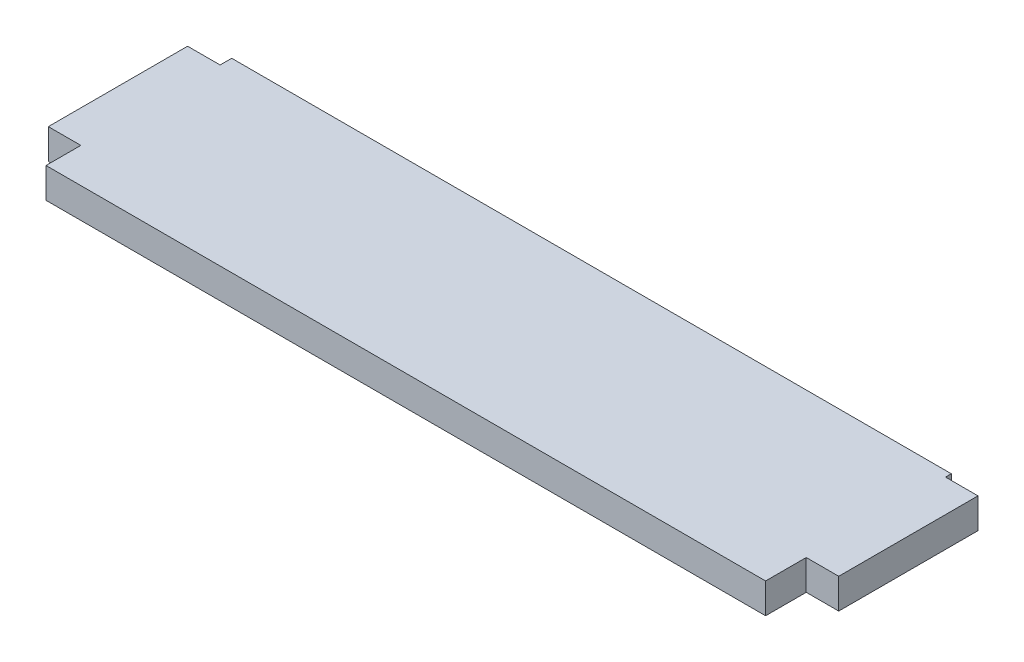
ISO-10303-21;
HEADER;
FILE_DESCRIPTION(('STEP AP214'),'2;1');
FILE_NAME('part.step','',(''),(''),'','','');
FILE_SCHEMA(('AUTOMOTIVE_DESIGN { 1 0 10303 214 1 1 1 1 }'));
ENDSEC;
DATA;
#1=APPLICATION_CONTEXT('core data for automotive mechanical design processes');
#2=APPLICATION_PROTOCOL_DEFINITION('international standard','automotive_design',2000,#1);
#3=PRODUCT_CONTEXT('',#1,'mechanical');
#4=PRODUCT('Part','Part','',(#3));
#5=PRODUCT_RELATED_PRODUCT_CATEGORY('part','',(#4));
#6=PRODUCT_DEFINITION_FORMATION('','',#4);
#7=PRODUCT_DEFINITION_CONTEXT('part definition',#1,'design');
#8=PRODUCT_DEFINITION('design','',#6,#7);
#9=PRODUCT_DEFINITION_SHAPE('','',#8);
#10=(LENGTH_UNIT() NAMED_UNIT(*) SI_UNIT(.MILLI.,.METRE.));
#11=(NAMED_UNIT(*) PLANE_ANGLE_UNIT() SI_UNIT($,.RADIAN.));
#12=(NAMED_UNIT(*) SI_UNIT($,.STERADIAN.) SOLID_ANGLE_UNIT());
#13=UNCERTAINTY_MEASURE_WITH_UNIT(LENGTH_MEASURE(1.E-05),#10,'distance_accuracy_value','');
#14=(GEOMETRIC_REPRESENTATION_CONTEXT(3) GLOBAL_UNCERTAINTY_ASSIGNED_CONTEXT((#13)) GLOBAL_UNIT_ASSIGNED_CONTEXT((#10,
#11,#12)) REPRESENTATION_CONTEXT('',''));
#15=CARTESIAN_POINT('',(0.,0.,0.));
#16=DIRECTION('',(0.,0.,1.));
#17=DIRECTION('',(1.,0.,0.));
#18=AXIS2_PLACEMENT_3D('',#15,#16,#17);
#19=CARTESIAN_POINT('',(15.5,1.3,-4.));
#20=DIRECTION('',(-1.,0.,0.));
#21=DIRECTION('',(0.,0.,1.));
#22=AXIS2_PLACEMENT_3D('',#19,#20,#21);
#23=PLANE('',#22);
#24=DIRECTION('',(0.,-1.,0.));
#25=VECTOR('',#24,1.);
#26=CARTESIAN_POINT('',(15.5,1.3,2.25));
#27=LINE('',#26,#25);
#28=CARTESIAN_POINT('',(15.5,1.3,2.25));
#29=VERTEX_POINT('',#28);
#30=CARTESIAN_POINT('',(15.5,0.,2.25));
#31=VERTEX_POINT('',#30);
#32=EDGE_CURVE('E281',#29,#31,#27,.T.);
#33=ORIENTED_EDGE('',*,*,#32,.F.);
#34=DIRECTION('',(0.,0.,-1.));
#35=VECTOR('',#34,1.);
#36=CARTESIAN_POINT('',(15.5,1.3,-4.));
#37=LINE('',#36,#35);
#38=CARTESIAN_POINT('',(15.5,1.3,4.));
#39=VERTEX_POINT('',#38);
#40=EDGE_CURVE('E204',#39,#29,#37,.T.);
#41=ORIENTED_EDGE('',*,*,#40,.F.);
#42=DIRECTION('',(0.,-1.,0.));
#43=VECTOR('',#42,1.);
#44=CARTESIAN_POINT('',(15.5,1.3,4.));
#45=LINE('',#44,#43);
#46=CARTESIAN_POINT('',(15.5,0.,4.));
#47=VERTEX_POINT('',#46);
#48=EDGE_CURVE('E220',#39,#47,#45,.T.);
#49=ORIENTED_EDGE('',*,*,#48,.T.);
#50=DIRECTION('',(0.,0.,-1.));
#51=VECTOR('',#50,1.);
#52=CARTESIAN_POINT('',(15.5,0.,-4.));
#53=LINE('',#52,#51);
#54=EDGE_CURVE('E221',#47,#31,#53,.T.);
#55=ORIENTED_EDGE('',*,*,#54,.T.);
#56=EDGE_LOOP('',(#33,#41,#49,#55));
#57=FACE_BOUND('',#56,.T.);
#58=ADVANCED_FACE('F43',(#57),#23,.F.);
#59=CARTESIAN_POINT('',(-15.5,1.3,-4.));
#60=DIRECTION('',(1.,0.,0.));
#61=DIRECTION('',(0.,0.,-1.));
#62=AXIS2_PLACEMENT_3D('',#59,#60,#61);
#63=PLANE('',#62);
#64=DIRECTION('',(0.,-1.,0.));
#65=VECTOR('',#64,1.);
#66=CARTESIAN_POINT('',(-15.5,1.3,-3.5));
#67=LINE('',#66,#65);
#68=CARTESIAN_POINT('',(-15.5,1.3,-3.5));
#69=VERTEX_POINT('',#68);
#70=CARTESIAN_POINT('',(-15.5,0.,-3.5));
#71=VERTEX_POINT('',#70);
#72=EDGE_CURVE('E200',#69,#71,#67,.T.);
#73=ORIENTED_EDGE('',*,*,#72,.F.);
#74=DIRECTION('',(0.,0.,1.));
#75=VECTOR('',#74,1.);
#76=CARTESIAN_POINT('',(-15.5,1.3,-4.));
#77=LINE('',#76,#75);
#78=CARTESIAN_POINT('',(-15.5,1.3,-4.));
#79=VERTEX_POINT('',#78);
#80=EDGE_CURVE('E213',#79,#69,#77,.T.);
#81=ORIENTED_EDGE('',*,*,#80,.F.);
#82=DIRECTION('',(0.,-1.,0.));
#83=VECTOR('',#82,1.);
#84=CARTESIAN_POINT('',(-15.5,1.3,-4.));
#85=LINE('',#84,#83);
#86=CARTESIAN_POINT('',(-15.5,0.,-4.));
#87=VERTEX_POINT('',#86);
#88=EDGE_CURVE('E52',#79,#87,#85,.T.);
#89=ORIENTED_EDGE('',*,*,#88,.T.);
#90=DIRECTION('',(0.,0.,1.));
#91=VECTOR('',#90,1.);
#92=CARTESIAN_POINT('',(-15.5,0.,-4.));
#93=LINE('',#92,#91);
#94=EDGE_CURVE('E229',#87,#71,#93,.T.);
#95=ORIENTED_EDGE('',*,*,#94,.T.);
#96=EDGE_LOOP('',(#73,#81,#89,#95));
#97=FACE_BOUND('',#96,.T.);
#98=ADVANCED_FACE('F249',(#97),#63,.F.);
#99=CARTESIAN_POINT('',(15.5,1.3,-3.75));
#100=VERTEX_POINT('',#99);
#101=CARTESIAN_POINT('',(15.5,1.3,-4.));
#102=VERTEX_POINT('',#101);
#103=EDGE_CURVE('E209',#100,#102,#37,.T.);
#104=ORIENTED_EDGE('',*,*,#103,.F.);
#105=DIRECTION('',(0.,-1.,0.));
#106=VECTOR('',#105,1.);
#107=CARTESIAN_POINT('',(15.5,1.3,-3.75));
#108=LINE('',#107,#106);
#109=CARTESIAN_POINT('',(15.5,0.,-3.75));
#110=VERTEX_POINT('',#109);
#111=EDGE_CURVE('E152',#100,#110,#108,.T.);
#112=ORIENTED_EDGE('',*,*,#111,.T.);
#113=CARTESIAN_POINT('',(15.5,0.,-4.));
#114=VERTEX_POINT('',#113);
#115=EDGE_CURVE('E158',#110,#114,#53,.T.);
#116=ORIENTED_EDGE('',*,*,#115,.T.);
#117=DIRECTION('',(0.,-1.,0.));
#118=VECTOR('',#117,1.);
#119=CARTESIAN_POINT('',(15.5,1.3,-4.));
#120=LINE('',#119,#118);
#121=EDGE_CURVE('E11',#102,#114,#120,.T.);
#122=ORIENTED_EDGE('',*,*,#121,.F.);
#123=EDGE_LOOP('',(#104,#112,#116,#122));
#124=FACE_BOUND('',#123,.T.);
#125=ADVANCED_FACE('F45',(#124),#23,.F.);
#126=CARTESIAN_POINT('',(-15.5,1.3,-4.));
#127=DIRECTION('',(0.,0.,1.));
#128=DIRECTION('',(1.,0.,0.));
#129=AXIS2_PLACEMENT_3D('',#126,#127,#128);
#130=PLANE('',#129);
#131=DIRECTION('',(-1.,0.,0.));
#132=VECTOR('',#131,1.);
#133=CARTESIAN_POINT('',(-15.5,0.,-4.));
#134=LINE('',#133,#132);
#135=EDGE_CURVE('E225',#114,#87,#134,.T.);
#136=ORIENTED_EDGE('',*,*,#135,.T.);
#137=ORIENTED_EDGE('',*,*,#88,.F.);
#138=DIRECTION('',(-1.,0.,0.));
#139=VECTOR('',#138,1.);
#140=CARTESIAN_POINT('',(-15.5,1.3,-4.));
#141=LINE('',#140,#139);
#142=EDGE_CURVE('E208',#102,#79,#141,.T.);
#143=ORIENTED_EDGE('',*,*,#142,.F.);
#144=ORIENTED_EDGE('',*,*,#121,.T.);
#145=EDGE_LOOP('',(#136,#137,#143,#144));
#146=FACE_BOUND('',#145,.T.);
#147=ADVANCED_FACE('F260',(#146),#130,.F.);
#148=CARTESIAN_POINT('',(-15.5,1.3,2.5));
#149=VERTEX_POINT('',#148);
#150=CARTESIAN_POINT('',(-15.5,1.3,4.));
#151=VERTEX_POINT('',#150);
#152=EDGE_CURVE('E212',#149,#151,#77,.T.);
#153=ORIENTED_EDGE('',*,*,#152,.F.);
#154=DIRECTION('',(0.,-1.,0.));
#155=VECTOR('',#154,1.);
#156=CARTESIAN_POINT('',(-15.5,1.3,2.5));
#157=LINE('',#156,#155);
#158=CARTESIAN_POINT('',(-15.5,0.,2.5));
#159=VERTEX_POINT('',#158);
#160=EDGE_CURVE('E183',#149,#159,#157,.T.);
#161=ORIENTED_EDGE('',*,*,#160,.T.);
#162=CARTESIAN_POINT('',(-15.5,0.,4.));
#163=VERTEX_POINT('',#162);
#164=EDGE_CURVE('E228',#159,#163,#93,.T.);
#165=ORIENTED_EDGE('',*,*,#164,.T.);
#166=DIRECTION('',(0.,-1.,0.));
#167=VECTOR('',#166,1.);
#168=CARTESIAN_POINT('',(-15.5,1.3,4.));
#169=LINE('',#168,#167);
#170=EDGE_CURVE('E239',#151,#163,#169,.T.);
#171=ORIENTED_EDGE('',*,*,#170,.F.);
#172=EDGE_LOOP('',(#153,#161,#165,#171));
#173=FACE_BOUND('',#172,.T.);
#174=ADVANCED_FACE('F272',(#173),#63,.F.);
#175=CARTESIAN_POINT('',(-15.5,1.3,4.));
#176=DIRECTION('',(0.,0.,-1.));
#177=DIRECTION('',(-1.,0.,0.));
#178=AXIS2_PLACEMENT_3D('',#175,#176,#177);
#179=PLANE('',#178);
#180=DIRECTION('',(1.,0.,0.));
#181=VECTOR('',#180,1.);
#182=CARTESIAN_POINT('',(-15.5,0.,4.));
#183=LINE('',#182,#181);
#184=EDGE_CURVE('E233',#163,#47,#183,.T.);
#185=ORIENTED_EDGE('',*,*,#184,.T.);
#186=ORIENTED_EDGE('',*,*,#48,.F.);
#187=DIRECTION('',(1.,0.,0.));
#188=VECTOR('',#187,1.);
#189=CARTESIAN_POINT('',(-15.5,1.3,4.));
#190=LINE('',#189,#188);
#191=EDGE_CURVE('E217',#151,#39,#190,.T.);
#192=ORIENTED_EDGE('',*,*,#191,.F.);
#193=ORIENTED_EDGE('',*,*,#170,.T.);
#194=EDGE_LOOP('',(#185,#186,#192,#193));
#195=FACE_BOUND('',#194,.T.);
#196=ADVANCED_FACE('F276',(#195),#179,.F.);
#197=CARTESIAN_POINT('',(0.,1.3,0.));
#198=DIRECTION('',(0.,1.,0.));
#199=DIRECTION('',(0.,0.,1.));
#200=AXIS2_PLACEMENT_3D('',#197,#198,#199);
#201=PLANE('',#200);
#202=ORIENTED_EDGE('',*,*,#40,.T.);
#203=DIRECTION('',(1.,0.,0.));
#204=VECTOR('',#203,1.);
#205=CARTESIAN_POINT('',(15.5,1.3,2.25));
#206=LINE('',#205,#204);
#207=CARTESIAN_POINT('',(16.9,1.3,2.25));
#208=VERTEX_POINT('',#207);
#209=EDGE_CURVE('E160',#29,#208,#206,.T.);
#210=ORIENTED_EDGE('',*,*,#209,.T.);
#211=DIRECTION('',(0.,0.,-1.));
#212=VECTOR('',#211,1.);
#213=CARTESIAN_POINT('',(16.9,1.3,-3.75));
#214=LINE('',#213,#212);
#215=CARTESIAN_POINT('',(16.9,1.3,-3.75));
#216=VERTEX_POINT('',#215);
#217=EDGE_CURVE('E163',#208,#216,#214,.T.);
#218=ORIENTED_EDGE('',*,*,#217,.T.);
#219=DIRECTION('',(-1.,0.,0.));
#220=VECTOR('',#219,1.);
#221=CARTESIAN_POINT('',(15.5,1.3,-3.75));
#222=LINE('',#221,#220);
#223=EDGE_CURVE('E150',#216,#100,#222,.T.);
#224=ORIENTED_EDGE('',*,*,#223,.T.);
#225=ORIENTED_EDGE('',*,*,#103,.T.);
#226=ORIENTED_EDGE('',*,*,#142,.T.);
#227=ORIENTED_EDGE('',*,*,#80,.T.);
#228=DIRECTION('',(-1.,0.,0.));
#229=VECTOR('',#228,1.);
#230=CARTESIAN_POINT('',(-15.5,1.3,-3.5));
#231=LINE('',#230,#229);
#232=CARTESIAN_POINT('',(-16.9,1.3,-3.5));
#233=VERTEX_POINT('',#232);
#234=EDGE_CURVE('E174',#69,#233,#231,.T.);
#235=ORIENTED_EDGE('',*,*,#234,.T.);
#236=DIRECTION('',(0.,0.,1.));
#237=VECTOR('',#236,1.);
#238=CARTESIAN_POINT('',(-16.9,1.3,-3.5));
#239=LINE('',#238,#237);
#240=CARTESIAN_POINT('',(-16.9,1.3,2.5));
#241=VERTEX_POINT('',#240);
#242=EDGE_CURVE('E177',#233,#241,#239,.T.);
#243=ORIENTED_EDGE('',*,*,#242,.T.);
#244=DIRECTION('',(1.,0.,0.));
#245=VECTOR('',#244,1.);
#246=CARTESIAN_POINT('',(-15.5,1.3,2.5));
#247=LINE('',#246,#245);
#248=EDGE_CURVE('E180',#241,#149,#247,.T.);
#249=ORIENTED_EDGE('',*,*,#248,.T.);
#250=ORIENTED_EDGE('',*,*,#152,.T.);
#251=ORIENTED_EDGE('',*,*,#191,.T.);
#252=EDGE_LOOP('',(#202,#210,#218,#224,#225,#226,#227,#235,#243,#249,#250,#251));
#253=FACE_BOUND('',#252,.T.);
#254=ADVANCED_FACE('F257',(#253),#201,.T.);
#255=CARTESIAN_POINT('',(0.,0.,0.));
#256=DIRECTION('',(0.,1.,0.));
#257=DIRECTION('',(0.,0.,1.));
#258=AXIS2_PLACEMENT_3D('',#255,#256,#257);
#259=PLANE('',#258);
#260=ORIENTED_EDGE('',*,*,#54,.F.);
#261=ORIENTED_EDGE('',*,*,#184,.F.);
#262=ORIENTED_EDGE('',*,*,#164,.F.);
#263=DIRECTION('',(1.,0.,0.));
#264=VECTOR('',#263,1.);
#265=CARTESIAN_POINT('',(-15.5,0.,2.5));
#266=LINE('',#265,#264);
#267=CARTESIAN_POINT('',(-16.9,0.,2.5));
#268=VERTEX_POINT('',#267);
#269=EDGE_CURVE('E67',#268,#159,#266,.T.);
#270=ORIENTED_EDGE('',*,*,#269,.F.);
#271=DIRECTION('',(0.,0.,1.));
#272=VECTOR('',#271,1.);
#273=CARTESIAN_POINT('',(-16.9,0.,-3.5));
#274=LINE('',#273,#272);
#275=CARTESIAN_POINT('',(-16.9,0.,-3.5));
#276=VERTEX_POINT('',#275);
#277=EDGE_CURVE('E186',#276,#268,#274,.T.);
#278=ORIENTED_EDGE('',*,*,#277,.F.);
#279=DIRECTION('',(-1.,0.,0.));
#280=VECTOR('',#279,1.);
#281=CARTESIAN_POINT('',(-15.5,0.,-3.5));
#282=LINE('',#281,#280);
#283=EDGE_CURVE('E169',#71,#276,#282,.T.);
#284=ORIENTED_EDGE('',*,*,#283,.F.);
#285=ORIENTED_EDGE('',*,*,#94,.F.);
#286=ORIENTED_EDGE('',*,*,#135,.F.);
#287=ORIENTED_EDGE('',*,*,#115,.F.);
#288=DIRECTION('',(-1.,0.,0.));
#289=VECTOR('',#288,1.);
#290=CARTESIAN_POINT('',(15.5,0.,-3.75));
#291=LINE('',#290,#289);
#292=CARTESIAN_POINT('',(16.9,0.,-3.75));
#293=VERTEX_POINT('',#292);
#294=EDGE_CURVE('E59',#293,#110,#291,.T.);
#295=ORIENTED_EDGE('',*,*,#294,.F.);
#296=DIRECTION('',(0.,0.,-1.));
#297=VECTOR('',#296,1.);
#298=CARTESIAN_POINT('',(16.9,0.,-3.75));
#299=LINE('',#298,#297);
#300=CARTESIAN_POINT('',(16.9,0.,2.25));
#301=VERTEX_POINT('',#300);
#302=EDGE_CURVE('E138',#301,#293,#299,.T.);
#303=ORIENTED_EDGE('',*,*,#302,.F.);
#304=DIRECTION('',(1.,0.,0.));
#305=VECTOR('',#304,1.);
#306=CARTESIAN_POINT('',(15.5,0.,2.25));
#307=LINE('',#306,#305);
#308=EDGE_CURVE('E147',#31,#301,#307,.T.);
#309=ORIENTED_EDGE('',*,*,#308,.F.);
#310=EDGE_LOOP('',(#260,#261,#262,#270,#278,#284,#285,#286,#287,#295,#303,#309));
#311=FACE_BOUND('',#310,.T.);
#312=ADVANCED_FACE('F156',(#311),#259,.F.);
#313=CARTESIAN_POINT('',(-15.5,1.3,-3.5));
#314=DIRECTION('',(0.,0.,1.));
#315=DIRECTION('',(1.,0.,0.));
#316=AXIS2_PLACEMENT_3D('',#313,#314,#315);
#317=PLANE('',#316);
#318=ORIENTED_EDGE('',*,*,#283,.T.);
#319=DIRECTION('',(0.,-1.,0.));
#320=VECTOR('',#319,1.);
#321=CARTESIAN_POINT('',(-16.9,1.3,-3.5));
#322=LINE('',#321,#320);
#323=EDGE_CURVE('E196',#233,#276,#322,.T.);
#324=ORIENTED_EDGE('',*,*,#323,.F.);
#325=ORIENTED_EDGE('',*,*,#234,.F.);
#326=ORIENTED_EDGE('',*,*,#72,.T.);
#327=EDGE_LOOP('',(#318,#324,#325,#326));
#328=FACE_BOUND('',#327,.T.);
#329=ADVANCED_FACE('F255',(#328),#317,.F.);
#330=CARTESIAN_POINT('',(-16.9,1.3,-3.5));
#331=DIRECTION('',(1.,0.,0.));
#332=DIRECTION('',(0.,0.,-1.));
#333=AXIS2_PLACEMENT_3D('',#330,#331,#332);
#334=PLANE('',#333);
#335=ORIENTED_EDGE('',*,*,#277,.T.);
#336=DIRECTION('',(0.,-1.,0.));
#337=VECTOR('',#336,1.);
#338=CARTESIAN_POINT('',(-16.9,1.3,2.5));
#339=LINE('',#338,#337);
#340=EDGE_CURVE('E193',#241,#268,#339,.T.);
#341=ORIENTED_EDGE('',*,*,#340,.F.);
#342=ORIENTED_EDGE('',*,*,#242,.F.);
#343=ORIENTED_EDGE('',*,*,#323,.T.);
#344=EDGE_LOOP('',(#335,#341,#342,#343));
#345=FACE_BOUND('',#344,.T.);
#346=ADVANCED_FACE('F297',(#345),#334,.F.);
#347=CARTESIAN_POINT('',(-15.5,1.3,2.5));
#348=DIRECTION('',(0.,0.,-1.));
#349=DIRECTION('',(-1.,0.,0.));
#350=AXIS2_PLACEMENT_3D('',#347,#348,#349);
#351=PLANE('',#350);
#352=ORIENTED_EDGE('',*,*,#269,.T.);
#353=ORIENTED_EDGE('',*,*,#160,.F.);
#354=ORIENTED_EDGE('',*,*,#248,.F.);
#355=ORIENTED_EDGE('',*,*,#340,.T.);
#356=EDGE_LOOP('',(#352,#353,#354,#355));
#357=FACE_BOUND('',#356,.T.);
#358=ADVANCED_FACE('F290',(#357),#351,.F.);
#359=CARTESIAN_POINT('',(15.5,1.3,2.25));
#360=DIRECTION('',(0.,0.,-1.));
#361=DIRECTION('',(-1.,0.,0.));
#362=AXIS2_PLACEMENT_3D('',#359,#360,#361);
#363=PLANE('',#362);
#364=ORIENTED_EDGE('',*,*,#308,.T.);
#365=DIRECTION('',(0.,-1.,0.));
#366=VECTOR('',#365,1.);
#367=CARTESIAN_POINT('',(16.9,1.3,2.25));
#368=LINE('',#367,#366);
#369=EDGE_CURVE('E144',#208,#301,#368,.T.);
#370=ORIENTED_EDGE('',*,*,#369,.F.);
#371=ORIENTED_EDGE('',*,*,#209,.F.);
#372=ORIENTED_EDGE('',*,*,#32,.T.);
#373=EDGE_LOOP('',(#364,#370,#371,#372));
#374=FACE_BOUND('',#373,.T.);
#375=ADVANCED_FACE('F283',(#374),#363,.F.);
#376=CARTESIAN_POINT('',(16.9,1.3,-3.75));
#377=DIRECTION('',(-1.,0.,0.));
#378=DIRECTION('',(0.,0.,1.));
#379=AXIS2_PLACEMENT_3D('',#376,#377,#378);
#380=PLANE('',#379);
#381=ORIENTED_EDGE('',*,*,#302,.T.);
#382=DIRECTION('',(0.,-1.,0.));
#383=VECTOR('',#382,1.);
#384=CARTESIAN_POINT('',(16.9,1.3,-3.75));
#385=LINE('',#384,#383);
#386=EDGE_CURVE('E141',#216,#293,#385,.T.);
#387=ORIENTED_EDGE('',*,*,#386,.F.);
#388=ORIENTED_EDGE('',*,*,#217,.F.);
#389=ORIENTED_EDGE('',*,*,#369,.T.);
#390=EDGE_LOOP('',(#381,#387,#388,#389));
#391=FACE_BOUND('',#390,.T.);
#392=ADVANCED_FACE('F139',(#391),#380,.F.);
#393=CARTESIAN_POINT('',(15.5,1.3,-3.75));
#394=DIRECTION('',(0.,0.,1.));
#395=DIRECTION('',(1.,0.,0.));
#396=AXIS2_PLACEMENT_3D('',#393,#394,#395);
#397=PLANE('',#396);
#398=ORIENTED_EDGE('',*,*,#294,.T.);
#399=ORIENTED_EDGE('',*,*,#111,.F.);
#400=ORIENTED_EDGE('',*,*,#223,.F.);
#401=ORIENTED_EDGE('',*,*,#386,.T.);
#402=EDGE_LOOP('',(#398,#399,#400,#401));
#403=FACE_BOUND('',#402,.T.);
#404=ADVANCED_FACE('F149',(#403),#397,.F.);
#405=CLOSED_SHELL('',(#58,#98,#125,#147,#174,#196,#254,#312,#329,#346,#358,#375,#392,#404));
#406=MANIFOLD_SOLID_BREP('B2',#405);
#407=ADVANCED_BREP_SHAPE_REPRESENTATION('',(#18,#406),#14);
#408=SHAPE_DEFINITION_REPRESENTATION(#9,#407);
ENDSEC;
END-ISO-10303-21;
